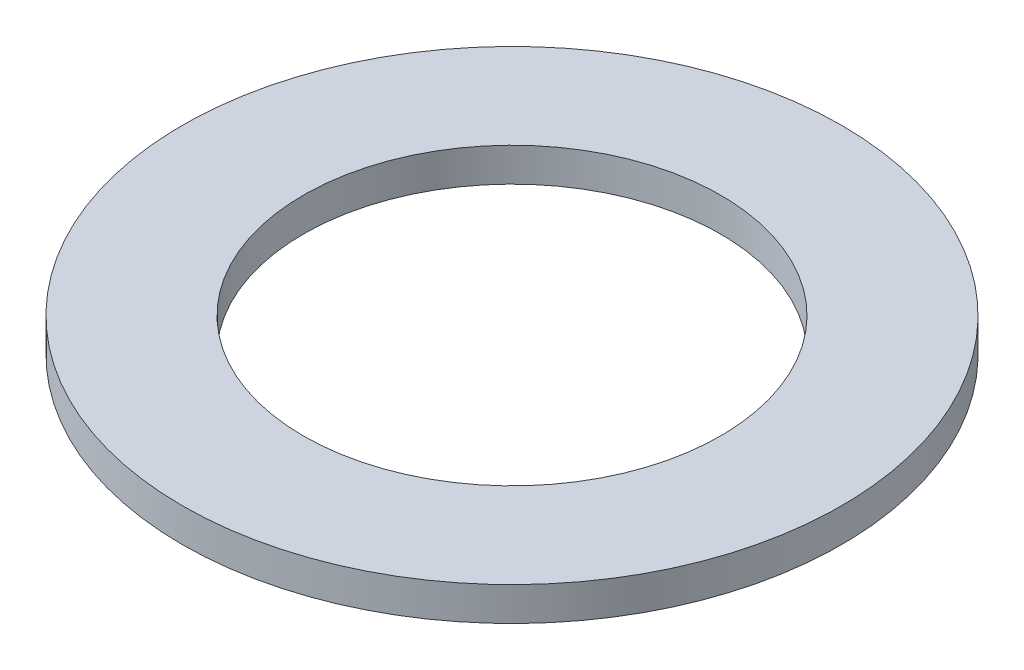
ISO-10303-21;
HEADER;
FILE_DESCRIPTION(('STEP AP214'),'2;1');
FILE_NAME('part.step','',(''),(''),'','','');
FILE_SCHEMA(('AUTOMOTIVE_DESIGN { 1 0 10303 214 1 1 1 1 }'));
ENDSEC;
DATA;
#1=APPLICATION_CONTEXT('core data for automotive mechanical design processes');
#2=APPLICATION_PROTOCOL_DEFINITION('international standard','automotive_design',2000,#1);
#3=PRODUCT_CONTEXT('',#1,'mechanical');
#4=PRODUCT('Part','Part','',(#3));
#5=PRODUCT_RELATED_PRODUCT_CATEGORY('part','',(#4));
#6=PRODUCT_DEFINITION_FORMATION('','',#4);
#7=PRODUCT_DEFINITION_CONTEXT('part definition',#1,'design');
#8=PRODUCT_DEFINITION('design','',#6,#7);
#9=PRODUCT_DEFINITION_SHAPE('','',#8);
#10=(LENGTH_UNIT() NAMED_UNIT(*) SI_UNIT(.MILLI.,.METRE.));
#11=(NAMED_UNIT(*) PLANE_ANGLE_UNIT() SI_UNIT($,.RADIAN.));
#12=(NAMED_UNIT(*) SI_UNIT($,.STERADIAN.) SOLID_ANGLE_UNIT());
#13=UNCERTAINTY_MEASURE_WITH_UNIT(LENGTH_MEASURE(1.E-05),#10,'distance_accuracy_value','');
#14=(GEOMETRIC_REPRESENTATION_CONTEXT(3) GLOBAL_UNCERTAINTY_ASSIGNED_CONTEXT((#13)) GLOBAL_UNIT_ASSIGNED_CONTEXT((#10,
#11,#12)) REPRESENTATION_CONTEXT('',''));
#15=CARTESIAN_POINT('',(0.,0.,0.));
#16=DIRECTION('',(0.,0.,1.));
#17=DIRECTION('',(1.,0.,0.));
#18=AXIS2_PLACEMENT_3D('',#15,#16,#17);
#19=CARTESIAN_POINT('',(0.,8.,0.));
#20=DIRECTION('',(0.,1.,0.));
#21=DIRECTION('',(0.,0.,1.));
#22=AXIS2_PLACEMENT_3D('',#19,#20,#21);
#23=PLANE('',#22);
#24=CARTESIAN_POINT('',(0.,8.,0.));
#25=DIRECTION('',(0.,1.,0.));
#26=DIRECTION('',(0.,0.,1.));
#27=AXIS2_PLACEMENT_3D('',#24,#25,#26);
#28=CIRCLE('',#27,78.2);
#29=CARTESIAN_POINT('',(0.,8.,78.2));
#30=VERTEX_POINT('',#29);
#31=EDGE_CURVE('E10',#30,#30,#28,.T.);
#32=ORIENTED_EDGE('',*,*,#31,.T.);
#33=EDGE_LOOP('',(#32));
#34=FACE_BOUND('',#33,.T.);
#35=CARTESIAN_POINT('',(0.,8.,0.));
#36=DIRECTION('',(0.,1.,0.));
#37=DIRECTION('',(0.,0.,1.));
#38=AXIS2_PLACEMENT_3D('',#35,#36,#37);
#39=CIRCLE('',#38,49.5);
#40=CARTESIAN_POINT('',(0.,8.,49.5));
#41=VERTEX_POINT('',#40);
#42=EDGE_CURVE('E44',#41,#41,#39,.T.);
#43=ORIENTED_EDGE('',*,*,#42,.F.);
#44=EDGE_LOOP('',(#43));
#45=FACE_BOUND('',#44,.T.);
#46=ADVANCED_FACE('F33',(#34,#45),#23,.T.);
#47=CARTESIAN_POINT('',(0.,0.,0.));
#48=DIRECTION('',(0.,1.,0.));
#49=DIRECTION('',(0.,0.,1.));
#50=AXIS2_PLACEMENT_3D('',#47,#48,#49);
#51=PLANE('',#50);
#52=CARTESIAN_POINT('',(0.,0.,0.));
#53=DIRECTION('',(0.,1.,0.));
#54=DIRECTION('',(0.,0.,1.));
#55=AXIS2_PLACEMENT_3D('',#52,#53,#54);
#56=CIRCLE('',#55,78.2);
#57=CARTESIAN_POINT('',(0.,0.,78.2));
#58=VERTEX_POINT('',#57);
#59=EDGE_CURVE('E37',#58,#58,#56,.T.);
#60=ORIENTED_EDGE('',*,*,#59,.F.);
#61=EDGE_LOOP('',(#60));
#62=FACE_BOUND('',#61,.T.);
#63=CARTESIAN_POINT('',(0.,0.,0.));
#64=DIRECTION('',(0.,1.,0.));
#65=DIRECTION('',(0.,0.,1.));
#66=AXIS2_PLACEMENT_3D('',#63,#64,#65);
#67=CIRCLE('',#66,49.5);
#68=CARTESIAN_POINT('',(0.,0.,49.5));
#69=VERTEX_POINT('',#68);
#70=EDGE_CURVE('E46',#69,#69,#67,.T.);
#71=ORIENTED_EDGE('',*,*,#70,.T.);
#72=EDGE_LOOP('',(#71));
#73=FACE_BOUND('',#72,.T.);
#74=ADVANCED_FACE('F56',(#62,#73),#51,.F.);
#75=CARTESIAN_POINT('',(0.,8.,0.));
#76=DIRECTION('',(0.,-1.,0.));
#77=DIRECTION('',(0.,0.,-1.));
#78=AXIS2_PLACEMENT_3D('',#75,#76,#77);
#79=CYLINDRICAL_SURFACE('',#78,78.2);
#80=ORIENTED_EDGE('',*,*,#31,.F.);
#81=EDGE_LOOP('',(#80));
#82=FACE_BOUND('',#81,.T.);
#83=ORIENTED_EDGE('',*,*,#59,.T.);
#84=EDGE_LOOP('',(#83));
#85=FACE_BOUND('',#84,.T.);
#86=ADVANCED_FACE('F35',(#82,#85),#79,.T.);
#87=CARTESIAN_POINT('',(0.,8.,0.));
#88=DIRECTION('',(0.,-1.,0.));
#89=DIRECTION('',(0.,0.,-1.));
#90=AXIS2_PLACEMENT_3D('',#87,#88,#89);
#91=CYLINDRICAL_SURFACE('',#90,49.5);
#92=ORIENTED_EDGE('',*,*,#42,.T.);
#93=EDGE_LOOP('',(#92));
#94=FACE_BOUND('',#93,.T.);
#95=ORIENTED_EDGE('',*,*,#70,.F.);
#96=EDGE_LOOP('',(#95));
#97=FACE_BOUND('',#96,.T.);
#98=ADVANCED_FACE('F52',(#94,#97),#91,.F.);
#99=CLOSED_SHELL('',(#46,#74,#86,#98));
#100=MANIFOLD_SOLID_BREP('B2',#99);
#101=ADVANCED_BREP_SHAPE_REPRESENTATION('',(#18,#100),#14);
#102=SHAPE_DEFINITION_REPRESENTATION(#9,#101);
ENDSEC;
END-ISO-10303-21;
